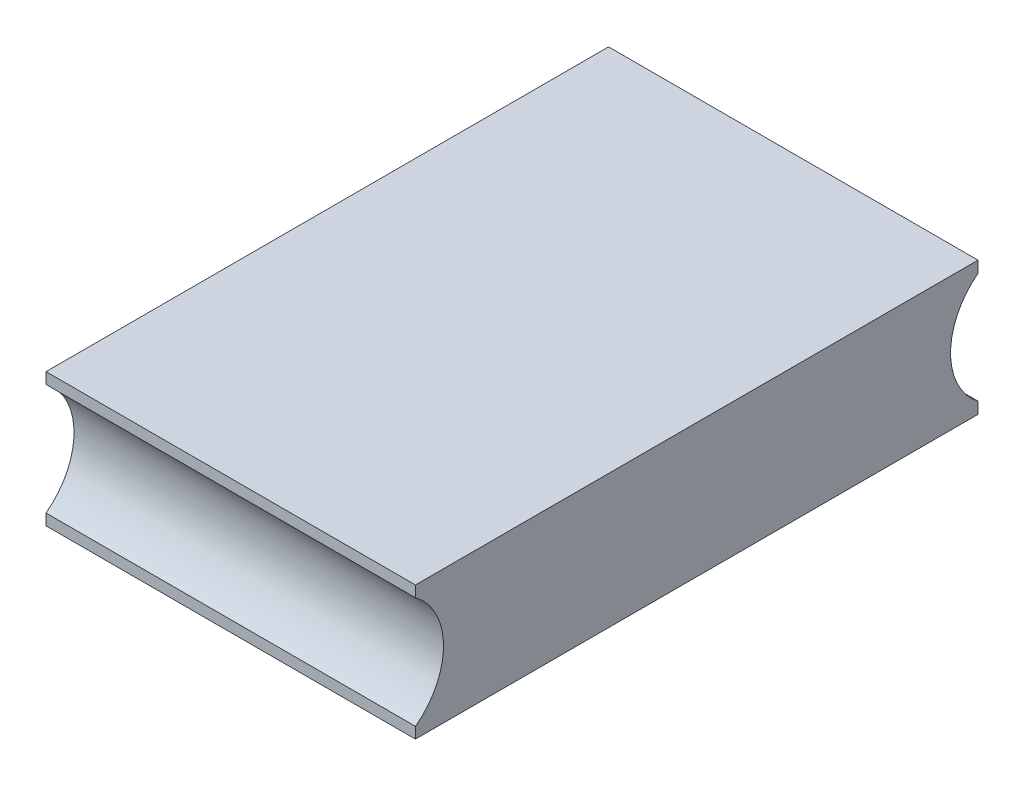
ISO-10303-21;
HEADER;
FILE_DESCRIPTION(('STEP AP214'),'2;1');
FILE_NAME('part.step','',(''),(''),'','','');
FILE_SCHEMA(('AUTOMOTIVE_DESIGN { 1 0 10303 214 1 1 1 1 }'));
ENDSEC;
DATA;
#1=APPLICATION_CONTEXT('core data for automotive mechanical design processes');
#2=APPLICATION_PROTOCOL_DEFINITION('international standard','automotive_design',2000,#1);
#3=PRODUCT_CONTEXT('',#1,'mechanical');
#4=PRODUCT('Part','Part','',(#3));
#5=PRODUCT_RELATED_PRODUCT_CATEGORY('part','',(#4));
#6=PRODUCT_DEFINITION_FORMATION('','',#4);
#7=PRODUCT_DEFINITION_CONTEXT('part definition',#1,'design');
#8=PRODUCT_DEFINITION('design','',#6,#7);
#9=PRODUCT_DEFINITION_SHAPE('','',#8);
#10=(LENGTH_UNIT() NAMED_UNIT(*) SI_UNIT(.MILLI.,.METRE.));
#11=(NAMED_UNIT(*) PLANE_ANGLE_UNIT() SI_UNIT($,.RADIAN.));
#12=(NAMED_UNIT(*) SI_UNIT($,.STERADIAN.) SOLID_ANGLE_UNIT());
#13=UNCERTAINTY_MEASURE_WITH_UNIT(LENGTH_MEASURE(1.E-05),#10,'distance_accuracy_value','');
#14=(GEOMETRIC_REPRESENTATION_CONTEXT(3) GLOBAL_UNCERTAINTY_ASSIGNED_CONTEXT((#13)) GLOBAL_UNIT_ASSIGNED_CONTEXT((#10,
#11,#12)) REPRESENTATION_CONTEXT('',''));
#15=CARTESIAN_POINT('',(0.,0.,0.));
#16=DIRECTION('',(0.,0.,1.));
#17=DIRECTION('',(1.,0.,0.));
#18=AXIS2_PLACEMENT_3D('',#15,#16,#17);
#19=CARTESIAN_POINT('',(40.,0.,-61.6404605225046));
#20=DIRECTION('',(-1.,0.,0.));
#21=DIRECTION('',(0.,0.,1.));
#22=AXIS2_PLACEMENT_3D('',#19,#20,#21);
#23=CYLINDRICAL_SURFACE('',#22,15.0424427680062);
#24=CARTESIAN_POINT('',(-40.,0.,-61.6404605225046));
#25=DIRECTION('',(-1.,0.,0.));
#26=DIRECTION('',(0.,0.,-1.));
#27=AXIS2_PLACEMENT_3D('',#24,#25,#26);
#28=CIRCLE('',#27,15.0424427680062);
#29=CARTESIAN_POINT('',(-40.,-11.9779859899116,-52.5408486596709));
#30=VERTEX_POINT('',#29);
#31=CARTESIAN_POINT('',(-40.,11.9779859899116,-52.5408486596709));
#32=VERTEX_POINT('',#31);
#33=EDGE_CURVE('E140',#30,#32,#28,.T.);
#34=ORIENTED_EDGE('',*,*,#33,.T.);
#35=DIRECTION('',(-1.,0.,0.));
#36=VECTOR('',#35,1.);
#37=CARTESIAN_POINT('',(40.,11.9779859899116,-52.5408486596709));
#38=LINE('',#37,#36);
#39=CARTESIAN_POINT('',(40.,11.9779859899116,-52.5408486596709));
#40=VERTEX_POINT('',#39);
#41=EDGE_CURVE('E11',#40,#32,#38,.T.);
#42=ORIENTED_EDGE('',*,*,#41,.F.);
#43=CARTESIAN_POINT('',(40.,0.,-61.6404605225046));
#44=DIRECTION('',(-1.,0.,0.));
#45=DIRECTION('',(0.,0.,-1.));
#46=AXIS2_PLACEMENT_3D('',#43,#44,#45);
#47=CIRCLE('',#46,15.0424427680062);
#48=CARTESIAN_POINT('',(40.,-11.9779859899116,-52.5408486596709));
#49=VERTEX_POINT('',#48);
#50=EDGE_CURVE('E162',#49,#40,#47,.T.);
#51=ORIENTED_EDGE('',*,*,#50,.F.);
#52=DIRECTION('',(-1.,0.,0.));
#53=VECTOR('',#52,1.);
#54=CARTESIAN_POINT('',(40.,-11.9779859899116,-52.5408486596709));
#55=LINE('',#54,#53);
#56=EDGE_CURVE('E136',#49,#30,#55,.T.);
#57=ORIENTED_EDGE('',*,*,#56,.T.);
#58=EDGE_LOOP('',(#34,#42,#51,#57));
#59=FACE_BOUND('',#58,.T.);
#60=ADVANCED_FACE('F39',(#59),#23,.F.);
#61=CARTESIAN_POINT('',(40.,14.4568322948009,-52.5408486596709));
#62=DIRECTION('',(0.,0.,1.));
#63=DIRECTION('',(1.,0.,0.));
#64=AXIS2_PLACEMENT_3D('',#61,#62,#63);
#65=PLANE('',#64);
#66=DIRECTION('',(0.,1.,0.));
#67=VECTOR('',#66,1.);
#68=CARTESIAN_POINT('',(-40.,14.4568322948009,-52.5408486596709));
#69=LINE('',#68,#67);
#70=CARTESIAN_POINT('',(-40.,14.4568322948009,-52.5408486596709));
#71=VERTEX_POINT('',#70);
#72=EDGE_CURVE('E144',#32,#71,#69,.T.);
#73=ORIENTED_EDGE('',*,*,#72,.T.);
#74=DIRECTION('',(-1.,0.,0.));
#75=VECTOR('',#74,1.);
#76=CARTESIAN_POINT('',(40.,14.4568322948009,-52.5408486596709));
#77=LINE('',#76,#75);
#78=CARTESIAN_POINT('',(40.,14.4568322948009,-52.5408486596709));
#79=VERTEX_POINT('',#78);
#80=EDGE_CURVE('E48',#79,#71,#77,.T.);
#81=ORIENTED_EDGE('',*,*,#80,.F.);
#82=DIRECTION('',(0.,1.,0.));
#83=VECTOR('',#82,1.);
#84=CARTESIAN_POINT('',(40.,14.4568322948009,-52.5408486596709));
#85=LINE('',#84,#83);
#86=EDGE_CURVE('E99',#40,#79,#85,.T.);
#87=ORIENTED_EDGE('',*,*,#86,.F.);
#88=ORIENTED_EDGE('',*,*,#41,.T.);
#89=EDGE_LOOP('',(#73,#81,#87,#88));
#90=FACE_BOUND('',#89,.T.);
#91=ADVANCED_FACE('F208',(#90),#65,.F.);
#92=CARTESIAN_POINT('',(40.,14.4568322948009,69.2669628047079));
#93=DIRECTION('',(0.,-1.,0.));
#94=DIRECTION('',(0.,0.,-1.));
#95=AXIS2_PLACEMENT_3D('',#92,#93,#94);
#96=PLANE('',#95);
#97=DIRECTION('',(0.,0.,1.));
#98=VECTOR('',#97,1.);
#99=CARTESIAN_POINT('',(-40.,14.4568322948009,69.2669628047079));
#100=LINE('',#99,#98);
#101=CARTESIAN_POINT('',(-40.,14.4568322948009,69.2669628047079));
#102=VERTEX_POINT('',#101);
#103=EDGE_CURVE('E147',#71,#102,#100,.T.);
#104=ORIENTED_EDGE('',*,*,#103,.T.);
#105=DIRECTION('',(-1.,0.,0.));
#106=VECTOR('',#105,1.);
#107=CARTESIAN_POINT('',(40.,14.4568322948009,69.2669628047079));
#108=LINE('',#107,#106);
#109=CARTESIAN_POINT('',(40.,14.4568322948009,69.2669628047079));
#110=VERTEX_POINT('',#109);
#111=EDGE_CURVE('E173',#110,#102,#108,.T.);
#112=ORIENTED_EDGE('',*,*,#111,.F.);
#113=DIRECTION('',(0.,0.,1.));
#114=VECTOR('',#113,1.);
#115=CARTESIAN_POINT('',(40.,14.4568322948009,69.2669628047079));
#116=LINE('',#115,#114);
#117=EDGE_CURVE('E183',#79,#110,#116,.T.);
#118=ORIENTED_EDGE('',*,*,#117,.F.);
#119=ORIENTED_EDGE('',*,*,#80,.T.);
#120=EDGE_LOOP('',(#104,#112,#118,#119));
#121=FACE_BOUND('',#120,.T.);
#122=ADVANCED_FACE('F181',(#121),#96,.F.);
#123=CARTESIAN_POINT('',(40.,12.0520650621502,69.2669628047079));
#124=DIRECTION('',(0.,0.,-1.));
#125=DIRECTION('',(-1.,0.,0.));
#126=AXIS2_PLACEMENT_3D('',#123,#124,#125);
#127=PLANE('',#126);
#128=DIRECTION('',(0.,-1.,0.));
#129=VECTOR('',#128,1.);
#130=CARTESIAN_POINT('',(-40.,12.0520650621502,69.2669628047079));
#131=LINE('',#130,#129);
#132=CARTESIAN_POINT('',(-40.,12.0520650621502,69.2669628047079));
#133=VERTEX_POINT('',#132);
#134=EDGE_CURVE('E150',#102,#133,#131,.T.);
#135=ORIENTED_EDGE('',*,*,#134,.T.);
#136=DIRECTION('',(-1.,0.,0.));
#137=VECTOR('',#136,1.);
#138=CARTESIAN_POINT('',(40.,12.0520650621502,69.2669628047079));
#139=LINE('',#138,#137);
#140=CARTESIAN_POINT('',(40.,12.0520650621502,69.2669628047079));
#141=VERTEX_POINT('',#140);
#142=EDGE_CURVE('E169',#141,#133,#139,.T.);
#143=ORIENTED_EDGE('',*,*,#142,.F.);
#144=DIRECTION('',(0.,-1.,0.));
#145=VECTOR('',#144,1.);
#146=CARTESIAN_POINT('',(40.,12.0520650621502,69.2669628047079));
#147=LINE('',#146,#145);
#148=EDGE_CURVE('E196',#110,#141,#147,.T.);
#149=ORIENTED_EDGE('',*,*,#148,.F.);
#150=ORIENTED_EDGE('',*,*,#111,.T.);
#151=EDGE_LOOP('',(#135,#143,#149,#150));
#152=FACE_BOUND('',#151,.T.);
#153=ADVANCED_FACE('F191',(#152),#127,.F.);
#154=CARTESIAN_POINT('',(40.,0.,78.1971211312829));
#155=DIRECTION('',(-1.,0.,0.));
#156=DIRECTION('',(0.,0.,1.));
#157=AXIS2_PLACEMENT_3D('',#154,#155,#156);
#158=CYLINDRICAL_SURFACE('',#157,15.);
#159=CARTESIAN_POINT('',(-40.,0.,78.1971211312829));
#160=DIRECTION('',(-1.,0.,0.));
#161=DIRECTION('',(0.,0.,-1.));
#162=AXIS2_PLACEMENT_3D('',#159,#160,#161);
#163=CIRCLE('',#162,15.);
#164=CARTESIAN_POINT('',(-40.,-12.0520650621502,69.2669628047079));
#165=VERTEX_POINT('',#164);
#166=EDGE_CURVE('E153',#133,#165,#163,.T.);
#167=ORIENTED_EDGE('',*,*,#166,.T.);
#168=DIRECTION('',(-1.,0.,0.));
#169=VECTOR('',#168,1.);
#170=CARTESIAN_POINT('',(40.,-12.0520650621502,69.2669628047079));
#171=LINE('',#170,#169);
#172=CARTESIAN_POINT('',(40.,-12.0520650621502,69.2669628047079));
#173=VERTEX_POINT('',#172);
#174=EDGE_CURVE('E129',#173,#165,#171,.T.);
#175=ORIENTED_EDGE('',*,*,#174,.F.);
#176=CARTESIAN_POINT('',(40.,0.,78.1971211312829));
#177=DIRECTION('',(-1.,0.,0.));
#178=DIRECTION('',(0.,0.,-1.));
#179=AXIS2_PLACEMENT_3D('',#176,#177,#178);
#180=CIRCLE('',#179,15.);
#181=EDGE_CURVE('E118',#141,#173,#180,.T.);
#182=ORIENTED_EDGE('',*,*,#181,.F.);
#183=ORIENTED_EDGE('',*,*,#142,.T.);
#184=EDGE_LOOP('',(#167,#175,#182,#183));
#185=FACE_BOUND('',#184,.T.);
#186=ADVANCED_FACE('F194',(#185),#158,.F.);
#187=CARTESIAN_POINT('',(40.,-12.0520650621502,69.2669628047079));
#188=DIRECTION('',(0.,0.,-1.));
#189=DIRECTION('',(-1.,0.,0.));
#190=AXIS2_PLACEMENT_3D('',#187,#188,#189);
#191=PLANE('',#190);
#192=DIRECTION('',(0.,-1.,0.));
#193=VECTOR('',#192,1.);
#194=CARTESIAN_POINT('',(-40.,-12.0520650621502,69.2669628047079));
#195=LINE('',#194,#193);
#196=CARTESIAN_POINT('',(-40.,-14.4568322948009,69.2669628047079));
#197=VERTEX_POINT('',#196);
#198=EDGE_CURVE('E127',#165,#197,#195,.T.);
#199=ORIENTED_EDGE('',*,*,#198,.T.);
#200=DIRECTION('',(-1.,0.,0.));
#201=VECTOR('',#200,1.);
#202=CARTESIAN_POINT('',(40.,-14.4568322948009,69.2669628047079));
#203=LINE('',#202,#201);
#204=CARTESIAN_POINT('',(40.,-14.4568322948009,69.2669628047079));
#205=VERTEX_POINT('',#204);
#206=EDGE_CURVE('E124',#205,#197,#203,.T.);
#207=ORIENTED_EDGE('',*,*,#206,.F.);
#208=DIRECTION('',(0.,-1.,0.));
#209=VECTOR('',#208,1.);
#210=CARTESIAN_POINT('',(40.,-12.0520650621502,69.2669628047079));
#211=LINE('',#210,#209);
#212=EDGE_CURVE('E112',#173,#205,#211,.T.);
#213=ORIENTED_EDGE('',*,*,#212,.F.);
#214=ORIENTED_EDGE('',*,*,#174,.T.);
#215=EDGE_LOOP('',(#199,#207,#213,#214));
#216=FACE_BOUND('',#215,.T.);
#217=ADVANCED_FACE('F125',(#216),#191,.F.);
#218=CARTESIAN_POINT('',(40.,-14.4568322948009,69.2669628047079));
#219=DIRECTION('',(0.,1.,0.));
#220=DIRECTION('',(0.,0.,1.));
#221=AXIS2_PLACEMENT_3D('',#218,#219,#220);
#222=PLANE('',#221);
#223=DIRECTION('',(0.,0.,-1.));
#224=VECTOR('',#223,1.);
#225=CARTESIAN_POINT('',(-40.,-14.4568322948009,69.2669628047079));
#226=LINE('',#225,#224);
#227=CARTESIAN_POINT('',(-40.,-14.4568322948009,-52.5408486596709));
#228=VERTEX_POINT('',#227);
#229=EDGE_CURVE('E85',#197,#228,#226,.T.);
#230=ORIENTED_EDGE('',*,*,#229,.T.);
#231=DIRECTION('',(-1.,0.,0.));
#232=VECTOR('',#231,1.);
#233=CARTESIAN_POINT('',(40.,-14.4568322948009,-52.5408486596709));
#234=LINE('',#233,#232);
#235=CARTESIAN_POINT('',(40.,-14.4568322948009,-52.5408486596709));
#236=VERTEX_POINT('',#235);
#237=EDGE_CURVE('E130',#236,#228,#234,.T.);
#238=ORIENTED_EDGE('',*,*,#237,.F.);
#239=DIRECTION('',(0.,0.,-1.));
#240=VECTOR('',#239,1.);
#241=CARTESIAN_POINT('',(40.,-14.4568322948009,69.2669628047079));
#242=LINE('',#241,#240);
#243=EDGE_CURVE('E116',#205,#236,#242,.T.);
#244=ORIENTED_EDGE('',*,*,#243,.F.);
#245=ORIENTED_EDGE('',*,*,#206,.T.);
#246=EDGE_LOOP('',(#230,#238,#244,#245));
#247=FACE_BOUND('',#246,.T.);
#248=ADVANCED_FACE('F132',(#247),#222,.F.);
#249=CARTESIAN_POINT('',(40.,-11.9779859899116,-52.5408486596709));
#250=DIRECTION('',(0.,0.,1.));
#251=DIRECTION('',(1.,0.,0.));
#252=AXIS2_PLACEMENT_3D('',#249,#250,#251);
#253=PLANE('',#252);
#254=DIRECTION('',(0.,1.,0.));
#255=VECTOR('',#254,1.);
#256=CARTESIAN_POINT('',(-40.,-11.9779859899116,-52.5408486596709));
#257=LINE('',#256,#255);
#258=EDGE_CURVE('E91',#228,#30,#257,.T.);
#259=ORIENTED_EDGE('',*,*,#258,.T.);
#260=ORIENTED_EDGE('',*,*,#56,.F.);
#261=DIRECTION('',(0.,1.,0.));
#262=VECTOR('',#261,1.);
#263=CARTESIAN_POINT('',(40.,-11.9779859899116,-52.5408486596709));
#264=LINE('',#263,#262);
#265=EDGE_CURVE('E56',#236,#49,#264,.T.);
#266=ORIENTED_EDGE('',*,*,#265,.F.);
#267=ORIENTED_EDGE('',*,*,#237,.T.);
#268=EDGE_LOOP('',(#259,#260,#266,#267));
#269=FACE_BOUND('',#268,.T.);
#270=ADVANCED_FACE('F224',(#269),#253,.F.);
#271=CARTESIAN_POINT('',(40.,0.,-61.6404605225046));
#272=DIRECTION('',(1.,0.,0.));
#273=DIRECTION('',(0.,0.,-1.));
#274=AXIS2_PLACEMENT_3D('',#271,#272,#273);
#275=PLANE('',#274);
#276=ORIENTED_EDGE('',*,*,#50,.T.);
#277=ORIENTED_EDGE('',*,*,#86,.T.);
#278=ORIENTED_EDGE('',*,*,#117,.T.);
#279=ORIENTED_EDGE('',*,*,#148,.T.);
#280=ORIENTED_EDGE('',*,*,#181,.T.);
#281=ORIENTED_EDGE('',*,*,#212,.T.);
#282=ORIENTED_EDGE('',*,*,#243,.T.);
#283=ORIENTED_EDGE('',*,*,#265,.T.);
#284=EDGE_LOOP('',(#276,#277,#278,#279,#280,#281,#282,#283));
#285=FACE_BOUND('',#284,.T.);
#286=ADVANCED_FACE('F114',(#285),#275,.T.);
#287=CARTESIAN_POINT('',(-40.,0.,-61.6404605225046));
#288=DIRECTION('',(1.,0.,0.));
#289=DIRECTION('',(0.,0.,-1.));
#290=AXIS2_PLACEMENT_3D('',#287,#288,#289);
#291=PLANE('',#290);
#292=ORIENTED_EDGE('',*,*,#33,.F.);
#293=ORIENTED_EDGE('',*,*,#258,.F.);
#294=ORIENTED_EDGE('',*,*,#229,.F.);
#295=ORIENTED_EDGE('',*,*,#198,.F.);
#296=ORIENTED_EDGE('',*,*,#166,.F.);
#297=ORIENTED_EDGE('',*,*,#134,.F.);
#298=ORIENTED_EDGE('',*,*,#103,.F.);
#299=ORIENTED_EDGE('',*,*,#72,.F.);
#300=EDGE_LOOP('',(#292,#293,#294,#295,#296,#297,#298,#299));
#301=FACE_BOUND('',#300,.T.);
#302=ADVANCED_FACE('F187',(#301),#291,.F.);
#303=CLOSED_SHELL('',(#60,#91,#122,#153,#186,#217,#248,#270,#286,#302));
#304=MANIFOLD_SOLID_BREP('B2',#303);
#305=ADVANCED_BREP_SHAPE_REPRESENTATION('',(#18,#304),#14);
#306=SHAPE_DEFINITION_REPRESENTATION(#9,#305);
ENDSEC;
END-ISO-10303-21;
